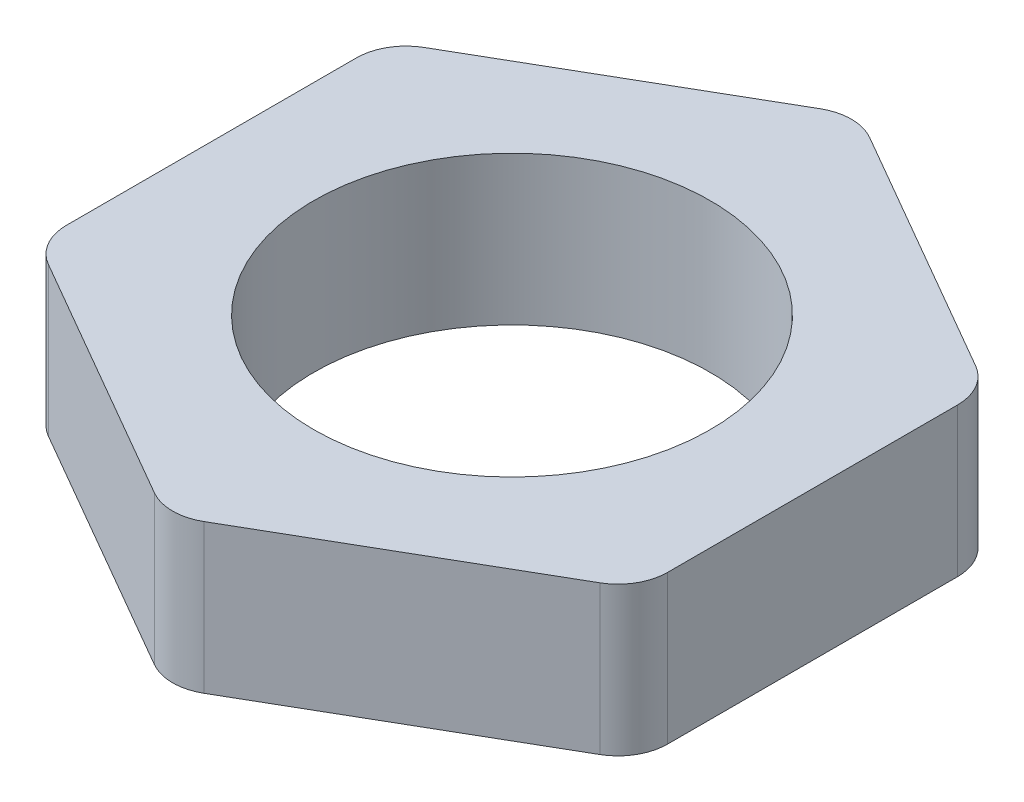
ISO-10303-21;
HEADER;
FILE_DESCRIPTION(('STEP AP214'),'2;1');
FILE_NAME('part.step','',(''),(''),'','','');
FILE_SCHEMA(('AUTOMOTIVE_DESIGN { 1 0 10303 214 1 1 1 1 }'));
ENDSEC;
DATA;
#1=APPLICATION_CONTEXT('core data for automotive mechanical design processes');
#2=APPLICATION_PROTOCOL_DEFINITION('international standard','automotive_design',2000,#1);
#3=PRODUCT_CONTEXT('',#1,'mechanical');
#4=PRODUCT('Part','Part','',(#3));
#5=PRODUCT_RELATED_PRODUCT_CATEGORY('part','',(#4));
#6=PRODUCT_DEFINITION_FORMATION('','',#4);
#7=PRODUCT_DEFINITION_CONTEXT('part definition',#1,'design');
#8=PRODUCT_DEFINITION('design','',#6,#7);
#9=PRODUCT_DEFINITION_SHAPE('','',#8);
#10=(LENGTH_UNIT() NAMED_UNIT(*) SI_UNIT(.MILLI.,.METRE.));
#11=(NAMED_UNIT(*) PLANE_ANGLE_UNIT() SI_UNIT($,.RADIAN.));
#12=(NAMED_UNIT(*) SI_UNIT($,.STERADIAN.) SOLID_ANGLE_UNIT());
#13=UNCERTAINTY_MEASURE_WITH_UNIT(LENGTH_MEASURE(1.E-05),#10,'distance_accuracy_value','');
#14=(GEOMETRIC_REPRESENTATION_CONTEXT(3) GLOBAL_UNCERTAINTY_ASSIGNED_CONTEXT((#13)) GLOBAL_UNIT_ASSIGNED_CONTEXT((#10,
#11,#12)) REPRESENTATION_CONTEXT('',''));
#15=CARTESIAN_POINT('',(0.,0.,0.));
#16=DIRECTION('',(0.,0.,1.));
#17=DIRECTION('',(1.,0.,0.));
#18=AXIS2_PLACEMENT_3D('',#15,#16,#17);
#19=CARTESIAN_POINT('',(-5.06217782649107,1.5,-2.92264973081037));
#20=DIRECTION('',(0.,1.,0.));
#21=DIRECTION('',(0.,0.,1.));
#22=AXIS2_PLACEMENT_3D('',#19,#20,#21);
#23=PLANE('',#22);
#24=CARTESIAN_POINT('',(-5.06217782649107,1.5,-2.92264973081037));
#25=DIRECTION('',(0.,1.,0.));
#26=DIRECTION('',(0.,0.,1.));
#27=AXIS2_PLACEMENT_3D('',#24,#25,#26);
#28=CIRCLE('',#27,1.);
#29=CARTESIAN_POINT('',(-5.56217782649107,1.5,-3.78867513459481));
#30=VERTEX_POINT('',#29);
#31=CARTESIAN_POINT('',(-6.06217782649107,1.5,-2.92264973081037));
#32=VERTEX_POINT('',#31);
#33=EDGE_CURVE('E189',#30,#32,#28,.T.);
#34=ORIENTED_EDGE('',*,*,#33,.T.);
#35=DIRECTION('',(0.,0.,1.));
#36=VECTOR('',#35,1.);
#37=CARTESIAN_POINT('',(-6.06217782649107,1.5,-2.92264973081037));
#38=LINE('',#37,#36);
#39=CARTESIAN_POINT('',(-6.06217782649107,1.5,2.92264973081037));
#40=VERTEX_POINT('',#39);
#41=EDGE_CURVE('E117',#32,#40,#38,.T.);
#42=ORIENTED_EDGE('',*,*,#41,.T.);
#43=CARTESIAN_POINT('',(-5.06217782649107,1.5,2.92264973081038));
#44=DIRECTION('',(0.,1.,0.));
#45=DIRECTION('',(0.,0.,1.));
#46=AXIS2_PLACEMENT_3D('',#43,#44,#45);
#47=CIRCLE('',#46,1.);
#48=CARTESIAN_POINT('',(-5.56217782649106,1.5,3.78867513459482));
#49=VERTEX_POINT('',#48);
#50=EDGE_CURVE('E216',#40,#49,#47,.T.);
#51=ORIENTED_EDGE('',*,*,#50,.T.);
#52=DIRECTION('',(0.866025403784439,0.,0.5));
#53=VECTOR('',#52,1.);
#54=CARTESIAN_POINT('',(-5.56217782649106,1.5,3.78867513459482));
#55=LINE('',#54,#53);
#56=CARTESIAN_POINT('',(-0.500000000000001,1.5,6.71132486540519));
#57=VERTEX_POINT('',#56);
#58=EDGE_CURVE('E235',#49,#57,#55,.T.);
#59=ORIENTED_EDGE('',*,*,#58,.T.);
#60=CARTESIAN_POINT('',(0.,1.5,5.84529946162075));
#61=DIRECTION('',(0.,1.,0.));
#62=DIRECTION('',(0.,0.,1.));
#63=AXIS2_PLACEMENT_3D('',#60,#61,#62);
#64=CIRCLE('',#63,1.);
#65=CARTESIAN_POINT('',(0.500000000000006,1.5,6.71132486540519));
#66=VERTEX_POINT('',#65);
#67=EDGE_CURVE('E232',#57,#66,#64,.T.);
#68=ORIENTED_EDGE('',*,*,#67,.T.);
#69=DIRECTION('',(0.866025403784439,0.,-0.5));
#70=VECTOR('',#69,1.);
#71=CARTESIAN_POINT('',(0.500000000000006,1.5,6.71132486540519));
#72=LINE('',#71,#70);
#73=CARTESIAN_POINT('',(5.56217782649107,1.5,3.78867513459482));
#74=VERTEX_POINT('',#73);
#75=EDGE_CURVE('E234',#66,#74,#72,.T.);
#76=ORIENTED_EDGE('',*,*,#75,.T.);
#77=CARTESIAN_POINT('',(5.06217782649107,1.5,2.92264973081038));
#78=DIRECTION('',(0.,1.,0.));
#79=DIRECTION('',(0.,0.,1.));
#80=AXIS2_PLACEMENT_3D('',#77,#78,#79);
#81=CIRCLE('',#80,1.);
#82=CARTESIAN_POINT('',(6.06217782649107,1.5,2.92264973081037));
#83=VERTEX_POINT('',#82);
#84=EDGE_CURVE('E237',#74,#83,#81,.T.);
#85=ORIENTED_EDGE('',*,*,#84,.T.);
#86=DIRECTION('',(0.,0.,-1.));
#87=VECTOR('',#86,1.);
#88=CARTESIAN_POINT('',(6.06217782649107,1.5,2.92264973081037));
#89=LINE('',#88,#87);
#90=CARTESIAN_POINT('',(6.06217782649107,1.5,-2.92264973081037));
#91=VERTEX_POINT('',#90);
#92=EDGE_CURVE('E243',#83,#91,#89,.T.);
#93=ORIENTED_EDGE('',*,*,#92,.T.);
#94=CARTESIAN_POINT('',(5.06217782649107,1.5,-2.92264973081038));
#95=DIRECTION('',(0.,1.,0.));
#96=DIRECTION('',(0.,0.,-1.));
#97=AXIS2_PLACEMENT_3D('',#94,#95,#96);
#98=CIRCLE('',#97,1.);
#99=CARTESIAN_POINT('',(5.56217782649106,1.5,-3.78867513459482));
#100=VERTEX_POINT('',#99);
#101=EDGE_CURVE('E148',#91,#100,#98,.T.);
#102=ORIENTED_EDGE('',*,*,#101,.T.);
#103=DIRECTION('',(-0.866025403784439,0.,-0.5));
#104=VECTOR('',#103,1.);
#105=CARTESIAN_POINT('',(5.56217782649106,1.5,-3.78867513459482));
#106=LINE('',#105,#104);
#107=CARTESIAN_POINT('',(0.500000000000004,1.5,-6.71132486540518));
#108=VERTEX_POINT('',#107);
#109=EDGE_CURVE('E142',#100,#108,#106,.T.);
#110=ORIENTED_EDGE('',*,*,#109,.T.);
#111=CARTESIAN_POINT('',(0.,1.5,-5.84529946162075));
#112=DIRECTION('',(0.,1.,0.));
#113=DIRECTION('',(0.,0.,1.));
#114=AXIS2_PLACEMENT_3D('',#111,#112,#113);
#115=CIRCLE('',#114,1.);
#116=CARTESIAN_POINT('',(-0.500000000000004,1.5,-6.71132486540518));
#117=VERTEX_POINT('',#116);
#118=EDGE_CURVE('E146',#108,#117,#115,.T.);
#119=ORIENTED_EDGE('',*,*,#118,.T.);
#120=DIRECTION('',(-0.866025403784439,0.,0.5));
#121=VECTOR('',#120,1.);
#122=CARTESIAN_POINT('',(-0.500000000000004,1.5,-6.71132486540518));
#123=LINE('',#122,#121);
#124=EDGE_CURVE('E62',#117,#30,#123,.T.);
#125=ORIENTED_EDGE('',*,*,#124,.T.);
#126=EDGE_LOOP('',(#34,#42,#51,#59,#68,#76,#85,#93,#102,#110,#119,#125));
#127=FACE_BOUND('',#126,.T.);
#128=CARTESIAN_POINT('',(0.,1.5,0.));
#129=DIRECTION('',(0.,1.,0.));
#130=DIRECTION('',(0.,0.,1.));
#131=AXIS2_PLACEMENT_3D('',#128,#129,#130);
#132=CIRCLE('',#131,4.);
#133=CARTESIAN_POINT('',(0.,1.5,4.));
#134=VERTEX_POINT('',#133);
#135=EDGE_CURVE('E170',#134,#134,#132,.T.);
#136=ORIENTED_EDGE('',*,*,#135,.F.);
#137=EDGE_LOOP('',(#136));
#138=FACE_BOUND('',#137,.T.);
#139=ADVANCED_FACE('F45',(#127,#138),#23,.T.);
#140=CARTESIAN_POINT('',(-5.06217782649107,-1.5,-2.92264973081037));
#141=DIRECTION('',(0.,1.,0.));
#142=DIRECTION('',(0.,0.,1.));
#143=AXIS2_PLACEMENT_3D('',#140,#141,#142);
#144=PLANE('',#143);
#145=CARTESIAN_POINT('',(-5.06217782649107,-1.5,-2.92264973081037));
#146=DIRECTION('',(0.,1.,0.));
#147=DIRECTION('',(0.,0.,1.));
#148=AXIS2_PLACEMENT_3D('',#145,#146,#147);
#149=CIRCLE('',#148,1.);
#150=CARTESIAN_POINT('',(-5.56217782649107,-1.5,-3.78867513459481));
#151=VERTEX_POINT('',#150);
#152=CARTESIAN_POINT('',(-6.06217782649107,-1.5,-2.92264973081037));
#153=VERTEX_POINT('',#152);
#154=EDGE_CURVE('E166',#151,#153,#149,.T.);
#155=ORIENTED_EDGE('',*,*,#154,.F.);
#156=DIRECTION('',(-0.866025403784439,0.,0.5));
#157=VECTOR('',#156,1.);
#158=CARTESIAN_POINT('',(-0.500000000000004,-1.5,-6.71132486540518));
#159=LINE('',#158,#157);
#160=CARTESIAN_POINT('',(-0.500000000000004,-1.5,-6.71132486540518));
#161=VERTEX_POINT('',#160);
#162=EDGE_CURVE('E109',#161,#151,#159,.T.);
#163=ORIENTED_EDGE('',*,*,#162,.F.);
#164=CARTESIAN_POINT('',(0.,-1.5,-5.84529946162075));
#165=DIRECTION('',(0.,1.,0.));
#166=DIRECTION('',(0.,0.,1.));
#167=AXIS2_PLACEMENT_3D('',#164,#165,#166);
#168=CIRCLE('',#167,1.);
#169=CARTESIAN_POINT('',(0.500000000000004,-1.5,-6.71132486540518));
#170=VERTEX_POINT('',#169);
#171=EDGE_CURVE('E103',#170,#161,#168,.T.);
#172=ORIENTED_EDGE('',*,*,#171,.F.);
#173=DIRECTION('',(-0.866025403784439,0.,-0.5));
#174=VECTOR('',#173,1.);
#175=CARTESIAN_POINT('',(5.56217782649106,-1.5,-3.78867513459482));
#176=LINE('',#175,#174);
#177=CARTESIAN_POINT('',(5.56217782649106,-1.5,-3.78867513459482));
#178=VERTEX_POINT('',#177);
#179=EDGE_CURVE('E156',#178,#170,#176,.T.);
#180=ORIENTED_EDGE('',*,*,#179,.F.);
#181=CARTESIAN_POINT('',(5.06217782649107,-1.5,-2.92264973081038));
#182=DIRECTION('',(0.,1.,0.));
#183=DIRECTION('',(0.,0.,-1.));
#184=AXIS2_PLACEMENT_3D('',#181,#182,#183);
#185=CIRCLE('',#184,1.);
#186=CARTESIAN_POINT('',(6.06217782649107,-1.5,-2.92264973081037));
#187=VERTEX_POINT('',#186);
#188=EDGE_CURVE('E184',#187,#178,#185,.T.);
#189=ORIENTED_EDGE('',*,*,#188,.F.);
#190=DIRECTION('',(0.,0.,-1.));
#191=VECTOR('',#190,1.);
#192=CARTESIAN_POINT('',(6.06217782649107,-1.5,2.92264973081037));
#193=LINE('',#192,#191);
#194=CARTESIAN_POINT('',(6.06217782649107,-1.5,2.92264973081037));
#195=VERTEX_POINT('',#194);
#196=EDGE_CURVE('E182',#195,#187,#193,.T.);
#197=ORIENTED_EDGE('',*,*,#196,.F.);
#198=CARTESIAN_POINT('',(5.06217782649107,-1.5,2.92264973081038));
#199=DIRECTION('',(0.,1.,0.));
#200=DIRECTION('',(0.,0.,1.));
#201=AXIS2_PLACEMENT_3D('',#198,#199,#200);
#202=CIRCLE('',#201,1.);
#203=CARTESIAN_POINT('',(5.56217782649107,-1.5,3.78867513459482));
#204=VERTEX_POINT('',#203);
#205=EDGE_CURVE('E180',#204,#195,#202,.T.);
#206=ORIENTED_EDGE('',*,*,#205,.F.);
#207=DIRECTION('',(0.866025403784439,0.,-0.5));
#208=VECTOR('',#207,1.);
#209=CARTESIAN_POINT('',(0.500000000000006,-1.5,6.71132486540519));
#210=LINE('',#209,#208);
#211=CARTESIAN_POINT('',(0.500000000000006,-1.5,6.71132486540519));
#212=VERTEX_POINT('',#211);
#213=EDGE_CURVE('E178',#212,#204,#210,.T.);
#214=ORIENTED_EDGE('',*,*,#213,.F.);
#215=CARTESIAN_POINT('',(0.,-1.5,5.84529946162075));
#216=DIRECTION('',(0.,1.,0.));
#217=DIRECTION('',(0.,0.,1.));
#218=AXIS2_PLACEMENT_3D('',#215,#216,#217);
#219=CIRCLE('',#218,1.);
#220=CARTESIAN_POINT('',(-0.500000000000001,-1.5,6.71132486540519));
#221=VERTEX_POINT('',#220);
#222=EDGE_CURVE('E176',#221,#212,#219,.T.);
#223=ORIENTED_EDGE('',*,*,#222,.F.);
#224=DIRECTION('',(0.866025403784439,0.,0.5));
#225=VECTOR('',#224,1.);
#226=CARTESIAN_POINT('',(-5.56217782649106,-1.5,3.78867513459482));
#227=LINE('',#226,#225);
#228=CARTESIAN_POINT('',(-5.56217782649106,-1.5,3.78867513459482));
#229=VERTEX_POINT('',#228);
#230=EDGE_CURVE('E174',#229,#221,#227,.T.);
#231=ORIENTED_EDGE('',*,*,#230,.F.);
#232=CARTESIAN_POINT('',(-5.06217782649107,-1.5,2.92264973081038));
#233=DIRECTION('',(0.,1.,0.));
#234=DIRECTION('',(0.,0.,1.));
#235=AXIS2_PLACEMENT_3D('',#232,#233,#234);
#236=CIRCLE('',#235,1.);
#237=CARTESIAN_POINT('',(-6.06217782649107,-1.5,2.92264973081037));
#238=VERTEX_POINT('',#237);
#239=EDGE_CURVE('E172',#238,#229,#236,.T.);
#240=ORIENTED_EDGE('',*,*,#239,.F.);
#241=DIRECTION('',(0.,0.,1.));
#242=VECTOR('',#241,1.);
#243=CARTESIAN_POINT('',(-6.06217782649107,-1.5,-2.92264973081037));
#244=LINE('',#243,#242);
#245=EDGE_CURVE('E169',#153,#238,#244,.T.);
#246=ORIENTED_EDGE('',*,*,#245,.F.);
#247=EDGE_LOOP('',(#155,#163,#172,#180,#189,#197,#206,#214,#223,#231,#240,#246));
#248=FACE_BOUND('',#247,.T.);
#249=CARTESIAN_POINT('',(0.,-1.5,0.));
#250=DIRECTION('',(0.,1.,0.));
#251=DIRECTION('',(0.,0.,1.));
#252=AXIS2_PLACEMENT_3D('',#249,#250,#251);
#253=CIRCLE('',#252,4.);
#254=CARTESIAN_POINT('',(0.,-1.5,4.));
#255=VERTEX_POINT('',#254);
#256=EDGE_CURVE('E548',#255,#255,#253,.T.);
#257=ORIENTED_EDGE('',*,*,#256,.T.);
#258=EDGE_LOOP('',(#257));
#259=FACE_BOUND('',#258,.T.);
#260=ADVANCED_FACE('F220',(#248,#259),#144,.F.);
#261=CARTESIAN_POINT('',(-5.06217782649107,1.5,-2.92264973081037));
#262=DIRECTION('',(0.,-1.,0.));
#263=DIRECTION('',(0.,0.,-1.));
#264=AXIS2_PLACEMENT_3D('',#261,#262,#263);
#265=CYLINDRICAL_SURFACE('',#264,1.);
#266=ORIENTED_EDGE('',*,*,#154,.T.);
#267=DIRECTION('',(0.,-1.,0.));
#268=VECTOR('',#267,1.);
#269=CARTESIAN_POINT('',(-6.06217782649107,1.5,-2.92264973081037));
#270=LINE('',#269,#268);
#271=EDGE_CURVE('E11',#32,#153,#270,.T.);
#272=ORIENTED_EDGE('',*,*,#271,.F.);
#273=ORIENTED_EDGE('',*,*,#33,.F.);
#274=DIRECTION('',(0.,-1.,0.));
#275=VECTOR('',#274,1.);
#276=CARTESIAN_POINT('',(-5.56217782649107,1.5,-3.78867513459481));
#277=LINE('',#276,#275);
#278=EDGE_CURVE('E162',#30,#151,#277,.T.);
#279=ORIENTED_EDGE('',*,*,#278,.T.);
#280=EDGE_LOOP('',(#266,#272,#273,#279));
#281=FACE_BOUND('',#280,.T.);
#282=ADVANCED_FACE('F47',(#281),#265,.T.);
#283=CARTESIAN_POINT('',(-6.06217782649107,1.5,-2.92264973081037));
#284=DIRECTION('',(1.,0.,0.));
#285=DIRECTION('',(0.,0.,-1.));
#286=AXIS2_PLACEMENT_3D('',#283,#284,#285);
#287=PLANE('',#286);
#288=ORIENTED_EDGE('',*,*,#245,.T.);
#289=DIRECTION('',(0.,-1.,0.));
#290=VECTOR('',#289,1.);
#291=CARTESIAN_POINT('',(-6.06217782649107,1.5,2.92264973081037));
#292=LINE('',#291,#290);
#293=EDGE_CURVE('E54',#40,#238,#292,.T.);
#294=ORIENTED_EDGE('',*,*,#293,.F.);
#295=ORIENTED_EDGE('',*,*,#41,.F.);
#296=ORIENTED_EDGE('',*,*,#271,.T.);
#297=EDGE_LOOP('',(#288,#294,#295,#296));
#298=FACE_BOUND('',#297,.T.);
#299=ADVANCED_FACE('F275',(#298),#287,.F.);
#300=CARTESIAN_POINT('',(-5.06217782649107,1.5,2.92264973081038));
#301=DIRECTION('',(0.,-1.,0.));
#302=DIRECTION('',(0.,0.,-1.));
#303=AXIS2_PLACEMENT_3D('',#300,#301,#302);
#304=CYLINDRICAL_SURFACE('',#303,1.);
#305=ORIENTED_EDGE('',*,*,#239,.T.);
#306=DIRECTION('',(0.,-1.,0.));
#307=VECTOR('',#306,1.);
#308=CARTESIAN_POINT('',(-5.56217782649106,1.5,3.78867513459482));
#309=LINE('',#308,#307);
#310=EDGE_CURVE('E208',#49,#229,#309,.T.);
#311=ORIENTED_EDGE('',*,*,#310,.F.);
#312=ORIENTED_EDGE('',*,*,#50,.F.);
#313=ORIENTED_EDGE('',*,*,#293,.T.);
#314=EDGE_LOOP('',(#305,#311,#312,#313));
#315=FACE_BOUND('',#314,.T.);
#316=ADVANCED_FACE('F214',(#315),#304,.T.);
#317=CARTESIAN_POINT('',(-5.56217782649106,1.5,3.78867513459482));
#318=DIRECTION('',(0.5,0.,-0.866025403784439));
#319=DIRECTION('',(-0.866025403784439,0.,-0.5));
#320=AXIS2_PLACEMENT_3D('',#317,#318,#319);
#321=PLANE('',#320);
#322=ORIENTED_EDGE('',*,*,#230,.T.);
#323=DIRECTION('',(0.,-1.,0.));
#324=VECTOR('',#323,1.);
#325=CARTESIAN_POINT('',(-0.500000000000001,1.5,6.71132486540519));
#326=LINE('',#325,#324);
#327=EDGE_CURVE('E205',#57,#221,#326,.T.);
#328=ORIENTED_EDGE('',*,*,#327,.F.);
#329=ORIENTED_EDGE('',*,*,#58,.F.);
#330=ORIENTED_EDGE('',*,*,#310,.T.);
#331=EDGE_LOOP('',(#322,#328,#329,#330));
#332=FACE_BOUND('',#331,.T.);
#333=ADVANCED_FACE('F226',(#332),#321,.F.);
#334=CARTESIAN_POINT('',(0.,1.5,5.84529946162075));
#335=DIRECTION('',(0.,-1.,0.));
#336=DIRECTION('',(0.,0.,-1.));
#337=AXIS2_PLACEMENT_3D('',#334,#335,#336);
#338=CYLINDRICAL_SURFACE('',#337,1.);
#339=ORIENTED_EDGE('',*,*,#222,.T.);
#340=DIRECTION('',(0.,-1.,0.));
#341=VECTOR('',#340,1.);
#342=CARTESIAN_POINT('',(0.500000000000006,1.5,6.71132486540519));
#343=LINE('',#342,#341);
#344=EDGE_CURVE('E202',#66,#212,#343,.T.);
#345=ORIENTED_EDGE('',*,*,#344,.F.);
#346=ORIENTED_EDGE('',*,*,#67,.F.);
#347=ORIENTED_EDGE('',*,*,#327,.T.);
#348=EDGE_LOOP('',(#339,#345,#346,#347));
#349=FACE_BOUND('',#348,.T.);
#350=ADVANCED_FACE('F230',(#349),#338,.T.);
#351=CARTESIAN_POINT('',(0.500000000000006,1.5,6.71132486540519));
#352=DIRECTION('',(-0.5,0.,-0.866025403784439));
#353=DIRECTION('',(-0.866025403784439,0.,0.5));
#354=AXIS2_PLACEMENT_3D('',#351,#352,#353);
#355=PLANE('',#354);
#356=ORIENTED_EDGE('',*,*,#213,.T.);
#357=DIRECTION('',(0.,-1.,0.));
#358=VECTOR('',#357,1.);
#359=CARTESIAN_POINT('',(5.56217782649107,1.5,3.78867513459482));
#360=LINE('',#359,#358);
#361=EDGE_CURVE('E199',#74,#204,#360,.T.);
#362=ORIENTED_EDGE('',*,*,#361,.F.);
#363=ORIENTED_EDGE('',*,*,#75,.F.);
#364=ORIENTED_EDGE('',*,*,#344,.T.);
#365=EDGE_LOOP('',(#356,#362,#363,#364));
#366=FACE_BOUND('',#365,.T.);
#367=ADVANCED_FACE('F286',(#366),#355,.F.);
#368=CARTESIAN_POINT('',(5.06217782649107,1.5,2.92264973081038));
#369=DIRECTION('',(0.,-1.,0.));
#370=DIRECTION('',(0.,0.,-1.));
#371=AXIS2_PLACEMENT_3D('',#368,#369,#370);
#372=CYLINDRICAL_SURFACE('',#371,1.);
#373=ORIENTED_EDGE('',*,*,#205,.T.);
#374=DIRECTION('',(0.,-1.,0.));
#375=VECTOR('',#374,1.);
#376=CARTESIAN_POINT('',(6.06217782649107,1.5,2.92264973081037));
#377=LINE('',#376,#375);
#378=EDGE_CURVE('E196',#83,#195,#377,.T.);
#379=ORIENTED_EDGE('',*,*,#378,.F.);
#380=ORIENTED_EDGE('',*,*,#84,.F.);
#381=ORIENTED_EDGE('',*,*,#361,.T.);
#382=EDGE_LOOP('',(#373,#379,#380,#381));
#383=FACE_BOUND('',#382,.T.);
#384=ADVANCED_FACE('F289',(#383),#372,.T.);
#385=CARTESIAN_POINT('',(6.06217782649107,1.5,2.92264973081037));
#386=DIRECTION('',(-1.,0.,0.));
#387=DIRECTION('',(0.,0.,1.));
#388=AXIS2_PLACEMENT_3D('',#385,#386,#387);
#389=PLANE('',#388);
#390=ORIENTED_EDGE('',*,*,#196,.T.);
#391=DIRECTION('',(0.,-1.,0.));
#392=VECTOR('',#391,1.);
#393=CARTESIAN_POINT('',(6.06217782649107,1.5,-2.92264973081037));
#394=LINE('',#393,#392);
#395=EDGE_CURVE('E193',#91,#187,#394,.T.);
#396=ORIENTED_EDGE('',*,*,#395,.F.);
#397=ORIENTED_EDGE('',*,*,#92,.F.);
#398=ORIENTED_EDGE('',*,*,#378,.T.);
#399=EDGE_LOOP('',(#390,#396,#397,#398));
#400=FACE_BOUND('',#399,.T.);
#401=ADVANCED_FACE('F249',(#400),#389,.F.);
#402=CARTESIAN_POINT('',(5.06217782649107,1.5,-2.92264973081038));
#403=DIRECTION('',(0.,-1.,0.));
#404=DIRECTION('',(0.,0.,-1.));
#405=AXIS2_PLACEMENT_3D('',#402,#403,#404);
#406=CYLINDRICAL_SURFACE('',#405,1.);
#407=ORIENTED_EDGE('',*,*,#188,.T.);
#408=DIRECTION('',(0.,-1.,0.));
#409=VECTOR('',#408,1.);
#410=CARTESIAN_POINT('',(5.56217782649106,1.5,-3.78867513459482));
#411=LINE('',#410,#409);
#412=EDGE_CURVE('E157',#100,#178,#411,.T.);
#413=ORIENTED_EDGE('',*,*,#412,.F.);
#414=ORIENTED_EDGE('',*,*,#101,.F.);
#415=ORIENTED_EDGE('',*,*,#395,.T.);
#416=EDGE_LOOP('',(#407,#413,#414,#415));
#417=FACE_BOUND('',#416,.T.);
#418=ADVANCED_FACE('F253',(#417),#406,.T.);
#419=CARTESIAN_POINT('',(5.56217782649106,1.5,-3.78867513459482));
#420=DIRECTION('',(-0.5,0.,0.866025403784439));
#421=DIRECTION('',(0.866025403784439,0.,0.5));
#422=AXIS2_PLACEMENT_3D('',#419,#420,#421);
#423=PLANE('',#422);
#424=ORIENTED_EDGE('',*,*,#179,.T.);
#425=DIRECTION('',(0.,-1.,0.));
#426=VECTOR('',#425,1.);
#427=CARTESIAN_POINT('',(0.500000000000004,1.5,-6.71132486540518));
#428=LINE('',#427,#426);
#429=EDGE_CURVE('E153',#108,#170,#428,.T.);
#430=ORIENTED_EDGE('',*,*,#429,.F.);
#431=ORIENTED_EDGE('',*,*,#109,.F.);
#432=ORIENTED_EDGE('',*,*,#412,.T.);
#433=EDGE_LOOP('',(#424,#430,#431,#432));
#434=FACE_BOUND('',#433,.T.);
#435=ADVANCED_FACE('F154',(#434),#423,.F.);
#436=CARTESIAN_POINT('',(0.,1.5,-5.84529946162075));
#437=DIRECTION('',(0.,-1.,0.));
#438=DIRECTION('',(0.,0.,-1.));
#439=AXIS2_PLACEMENT_3D('',#436,#437,#438);
#440=CYLINDRICAL_SURFACE('',#439,1.);
#441=ORIENTED_EDGE('',*,*,#171,.T.);
#442=DIRECTION('',(0.,-1.,0.));
#443=VECTOR('',#442,1.);
#444=CARTESIAN_POINT('',(-0.500000000000004,1.5,-6.71132486540518));
#445=LINE('',#444,#443);
#446=EDGE_CURVE('E158',#117,#161,#445,.T.);
#447=ORIENTED_EDGE('',*,*,#446,.F.);
#448=ORIENTED_EDGE('',*,*,#118,.F.);
#449=ORIENTED_EDGE('',*,*,#429,.T.);
#450=EDGE_LOOP('',(#441,#447,#448,#449));
#451=FACE_BOUND('',#450,.T.);
#452=ADVANCED_FACE('F160',(#451),#440,.T.);
#453=CARTESIAN_POINT('',(-0.500000000000004,1.5,-6.71132486540518));
#454=DIRECTION('',(0.5,0.,0.866025403784439));
#455=DIRECTION('',(0.866025403784439,0.,-0.5));
#456=AXIS2_PLACEMENT_3D('',#453,#454,#455);
#457=PLANE('',#456);
#458=ORIENTED_EDGE('',*,*,#162,.T.);
#459=ORIENTED_EDGE('',*,*,#278,.F.);
#460=ORIENTED_EDGE('',*,*,#124,.F.);
#461=ORIENTED_EDGE('',*,*,#446,.T.);
#462=EDGE_LOOP('',(#458,#459,#460,#461));
#463=FACE_BOUND('',#462,.T.);
#464=ADVANCED_FACE('F257',(#463),#457,.F.);
#465=CARTESIAN_POINT('',(0.,1.5,0.));
#466=DIRECTION('',(0.,-1.,0.));
#467=DIRECTION('',(0.,0.,-1.));
#468=AXIS2_PLACEMENT_3D('',#465,#466,#467);
#469=CYLINDRICAL_SURFACE('',#468,4.);
#470=ORIENTED_EDGE('',*,*,#135,.T.);
#471=EDGE_LOOP('',(#470));
#472=FACE_BOUND('',#471,.T.);
#473=ORIENTED_EDGE('',*,*,#256,.F.);
#474=EDGE_LOOP('',(#473));
#475=FACE_BOUND('',#474,.T.);
#476=ADVANCED_FACE('F259',(#472,#475),#469,.F.);
#477=CLOSED_SHELL('',(#139,#260,#282,#299,#316,#333,#350,#367,#384,#401,#418,#435,#452,#464,#476));
#478=MANIFOLD_SOLID_BREP('B2',#477);
#479=ADVANCED_BREP_SHAPE_REPRESENTATION('',(#18,#478),#14);
#480=SHAPE_DEFINITION_REPRESENTATION(#9,#479);
ENDSEC;
END-ISO-10303-21;
